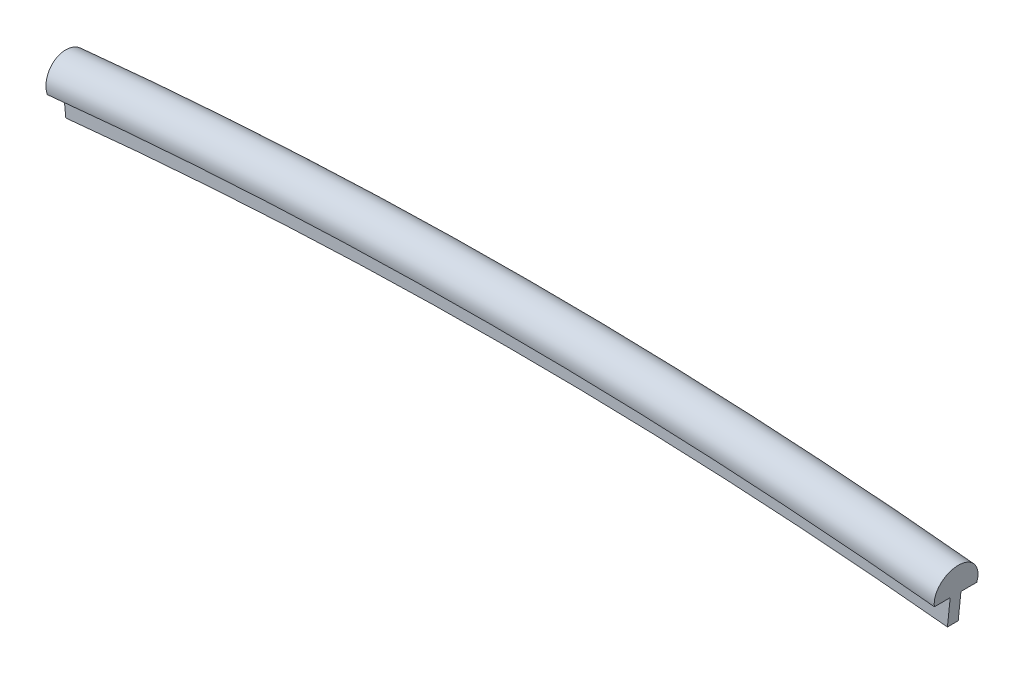
ISO-10303-21;
HEADER;
FILE_DESCRIPTION(('STEP AP214'),'2;1');
FILE_NAME('part.step','',(''),(''),'','','');
FILE_SCHEMA(('AUTOMOTIVE_DESIGN { 1 0 10303 214 1 1 1 1 }'));
ENDSEC;
DATA;
#1=APPLICATION_CONTEXT('core data for automotive mechanical design processes');
#2=APPLICATION_PROTOCOL_DEFINITION('international standard','automotive_design',2000,#1);
#3=PRODUCT_CONTEXT('',#1,'mechanical');
#4=PRODUCT('Part','Part','',(#3));
#5=PRODUCT_RELATED_PRODUCT_CATEGORY('part','',(#4));
#6=PRODUCT_DEFINITION_FORMATION('','',#4);
#7=PRODUCT_DEFINITION_CONTEXT('part definition',#1,'design');
#8=PRODUCT_DEFINITION('design','',#6,#7);
#9=PRODUCT_DEFINITION_SHAPE('','',#8);
#10=(LENGTH_UNIT() NAMED_UNIT(*) SI_UNIT(.MILLI.,.METRE.));
#11=(NAMED_UNIT(*) PLANE_ANGLE_UNIT() SI_UNIT($,.RADIAN.));
#12=(NAMED_UNIT(*) SI_UNIT($,.STERADIAN.) SOLID_ANGLE_UNIT());
#13=UNCERTAINTY_MEASURE_WITH_UNIT(LENGTH_MEASURE(1.E-05),#10,'distance_accuracy_value','');
#14=(GEOMETRIC_REPRESENTATION_CONTEXT(3) GLOBAL_UNCERTAINTY_ASSIGNED_CONTEXT((#13)) GLOBAL_UNIT_ASSIGNED_CONTEXT((#10,
#11,#12)) REPRESENTATION_CONTEXT('',''));
#15=CARTESIAN_POINT('',(0.,0.,0.));
#16=DIRECTION('',(0.,0.,1.));
#17=DIRECTION('',(1.,0.,0.));
#18=AXIS2_PLACEMENT_3D('',#15,#16,#17);
#19=CARTESIAN_POINT('',(0.,0.,70.5976415970385));
#20=DIRECTION('',(0.,0.,1.));
#21=DIRECTION('',(1.,0.,0.));
#22=AXIS2_PLACEMENT_3D('',#19,#20,#21);
#23=CYLINDRICAL_SURFACE('',#22,241.3);
#24=CARTESIAN_POINT('',(0.,0.,1.18));
#25=DIRECTION('',(0.,0.,1.));
#26=DIRECTION('',(1.,0.,0.));
#27=AXIS2_PLACEMENT_3D('',#24,#25,#26);
#28=CIRCLE('',#27,241.3);
#29=CARTESIAN_POINT('',(24.7066466184264,240.031813751578,1.18));
#30=VERTEX_POINT('',#29);
#31=CARTESIAN_POINT('',(-24.7066466184264,240.031813751578,1.18));
#32=VERTEX_POINT('',#31);
#33=EDGE_CURVE('E11',#30,#32,#28,.T.);
#34=ORIENTED_EDGE('',*,*,#33,.T.);
#35=DIRECTION('',(0.,0.,-1.));
#36=VECTOR('',#35,1.);
#37=CARTESIAN_POINT('',(-24.7066466184264,240.031813751578,1.18));
#38=LINE('',#37,#36);
#39=CARTESIAN_POINT('',(-24.7066466184264,240.031813751578,0.3));
#40=VERTEX_POINT('',#39);
#41=EDGE_CURVE('E103',#32,#40,#38,.T.);
#42=ORIENTED_EDGE('',*,*,#41,.T.);
#43=CARTESIAN_POINT('',(0.,0.,0.299999999999995));
#44=DIRECTION('',(0.,0.,1.));
#45=DIRECTION('',(1.,0.,0.));
#46=AXIS2_PLACEMENT_3D('',#43,#44,#45);
#47=CIRCLE('',#46,241.3);
#48=CARTESIAN_POINT('',(24.7066466184264,240.031813751578,0.3));
#49=VERTEX_POINT('',#48);
#50=EDGE_CURVE('E85',#49,#40,#47,.T.);
#51=ORIENTED_EDGE('',*,*,#50,.F.);
#52=DIRECTION('',(0.,0.,-1.));
#53=VECTOR('',#52,1.);
#54=CARTESIAN_POINT('',(24.7066466184264,240.031813751578,1.18));
#55=LINE('',#54,#53);
#56=EDGE_CURVE('E117',#30,#49,#55,.T.);
#57=ORIENTED_EDGE('',*,*,#56,.F.);
#58=EDGE_LOOP('',(#34,#42,#51,#57));
#59=FACE_BOUND('',#58,.T.);
#60=ADVANCED_FACE('F33',(#59),#23,.F.);
#61=CARTESIAN_POINT('',(0.,0.,0.));
#62=DIRECTION('',(0.,0.,1.));
#63=DIRECTION('',(1.,0.,0.));
#64=AXIS2_PLACEMENT_3D('',#61,#62,#63);
#65=TOROIDAL_SURFACE('',#64,241.586013989906,1.21416802890791);
#66=CARTESIAN_POINT('',(0.,0.,-1.18));
#67=DIRECTION('',(0.,0.,1.));
#68=DIRECTION('',(1.,0.,0.));
#69=AXIS2_PLACEMENT_3D('',#66,#67,#68);
#70=CIRCLE('',#69,241.3);
#71=CARTESIAN_POINT('',(24.7066466184264,240.031813751578,-1.18));
#72=VERTEX_POINT('',#71);
#73=CARTESIAN_POINT('',(-24.7066466184264,240.031813751578,-1.18));
#74=VERTEX_POINT('',#73);
#75=EDGE_CURVE('E41',#72,#74,#70,.T.);
#76=ORIENTED_EDGE('',*,*,#75,.T.);
#77=CARTESIAN_POINT('',(-24.7359315192824,240.316324554543,0.));
#78=DIRECTION('',(0.994744358688678,0.102389749765547,0.));
#79=DIRECTION('',(0.,0.,1.));
#80=AXIS2_PLACEMENT_3D('',#77,#78,#79);
#81=CIRCLE('',#80,1.21416802890791);
#82=EDGE_CURVE('E115',#74,#32,#81,.T.);
#83=ORIENTED_EDGE('',*,*,#82,.T.);
#84=ORIENTED_EDGE('',*,*,#33,.F.);
#85=CARTESIAN_POINT('',(24.7359315192824,240.316324554543,0.));
#86=DIRECTION('',(0.994744358688678,-0.102389749765547,0.));
#87=DIRECTION('',(0.,0.,1.));
#88=AXIS2_PLACEMENT_3D('',#85,#86,#87);
#89=CIRCLE('',#88,1.21416802890791);
#90=EDGE_CURVE('E97',#72,#30,#89,.T.);
#91=ORIENTED_EDGE('',*,*,#90,.F.);
#92=EDGE_LOOP('',(#76,#83,#84,#91));
#93=FACE_BOUND('',#92,.T.);
#94=ADVANCED_FACE('F35',(#93),#65,.T.);
#95=CARTESIAN_POINT('',(0.,0.,70.5976415970385));
#96=DIRECTION('',(0.,0.,1.));
#97=DIRECTION('',(1.,0.,0.));
#98=AXIS2_PLACEMENT_3D('',#95,#96,#97);
#99=CYLINDRICAL_SURFACE('',#98,241.3);
#100=CARTESIAN_POINT('',(0.,0.,-0.299999999999995));
#101=DIRECTION('',(0.,0.,1.));
#102=DIRECTION('',(1.,0.,0.));
#103=AXIS2_PLACEMENT_3D('',#100,#101,#102);
#104=CIRCLE('',#103,241.3);
#105=CARTESIAN_POINT('',(24.7066466184264,240.031813751578,-0.3));
#106=VERTEX_POINT('',#105);
#107=CARTESIAN_POINT('',(-24.7066466184264,240.031813751578,-0.3));
#108=VERTEX_POINT('',#107);
#109=EDGE_CURVE('E132',#106,#108,#104,.T.);
#110=ORIENTED_EDGE('',*,*,#109,.T.);
#111=DIRECTION('',(0.,0.,-1.));
#112=VECTOR('',#111,1.);
#113=CARTESIAN_POINT('',(-24.7066466184264,240.031813751578,-0.3));
#114=LINE('',#113,#112);
#115=EDGE_CURVE('E113',#108,#74,#114,.T.);
#116=ORIENTED_EDGE('',*,*,#115,.T.);
#117=ORIENTED_EDGE('',*,*,#75,.F.);
#118=DIRECTION('',(0.,0.,-1.));
#119=VECTOR('',#118,1.);
#120=CARTESIAN_POINT('',(24.7066466184264,240.031813751578,-0.3));
#121=LINE('',#120,#119);
#122=EDGE_CURVE('E125',#106,#72,#121,.T.);
#123=ORIENTED_EDGE('',*,*,#122,.F.);
#124=EDGE_LOOP('',(#110,#116,#117,#123));
#125=FACE_BOUND('',#124,.T.);
#126=ADVANCED_FACE('F134',(#125),#99,.F.);
#127=CARTESIAN_POINT('',(24.5530619937781,238.539697213545,-0.3));
#128=DIRECTION('',(0.,0.,1.));
#129=DIRECTION('',(1.,0.,0.));
#130=AXIS2_PLACEMENT_3D('',#127,#128,#129);
#131=PLANE('',#130);
#132=CARTESIAN_POINT('',(0.,0.,-0.299999999999995));
#133=DIRECTION('',(0.,0.,1.));
#134=DIRECTION('',(1.,0.,0.));
#135=AXIS2_PLACEMENT_3D('',#132,#133,#134);
#136=CIRCLE('',#135,239.8);
#137=CARTESIAN_POINT('',(24.5530619937781,238.539697213545,-0.3));
#138=VERTEX_POINT('',#137);
#139=CARTESIAN_POINT('',(-24.5530619937781,238.539697213545,-0.3));
#140=VERTEX_POINT('',#139);
#141=EDGE_CURVE('E129',#138,#140,#136,.T.);
#142=ORIENTED_EDGE('',*,*,#141,.T.);
#143=DIRECTION('',(-0.102389749765547,0.994744358688678,0.));
#144=VECTOR('',#143,1.);
#145=CARTESIAN_POINT('',(-24.5530619937781,238.539697213545,-0.3));
#146=LINE('',#145,#144);
#147=EDGE_CURVE('E110',#140,#108,#146,.T.);
#148=ORIENTED_EDGE('',*,*,#147,.T.);
#149=ORIENTED_EDGE('',*,*,#109,.F.);
#150=DIRECTION('',(0.102389749765547,0.994744358688678,0.));
#151=VECTOR('',#150,1.);
#152=CARTESIAN_POINT('',(24.5530619937781,238.539697213545,-0.3));
#153=LINE('',#152,#151);
#154=EDGE_CURVE('E122',#138,#106,#153,.T.);
#155=ORIENTED_EDGE('',*,*,#154,.F.);
#156=EDGE_LOOP('',(#142,#148,#149,#155));
#157=FACE_BOUND('',#156,.T.);
#158=ADVANCED_FACE('F136',(#157),#131,.F.);
#159=CARTESIAN_POINT('',(0.,0.,70.5976415970385));
#160=DIRECTION('',(0.,0.,1.));
#161=DIRECTION('',(1.,0.,0.));
#162=AXIS2_PLACEMENT_3D('',#159,#160,#161);
#163=CYLINDRICAL_SURFACE('',#162,239.8);
#164=CARTESIAN_POINT('',(0.,0.,0.299999999999995));
#165=DIRECTION('',(0.,0.,1.));
#166=DIRECTION('',(1.,0.,0.));
#167=AXIS2_PLACEMENT_3D('',#164,#165,#166);
#168=CIRCLE('',#167,239.8);
#169=CARTESIAN_POINT('',(24.5530619937781,238.539697213545,0.3));
#170=VERTEX_POINT('',#169);
#171=CARTESIAN_POINT('',(-24.5530619937781,238.539697213545,0.3));
#172=VERTEX_POINT('',#171);
#173=EDGE_CURVE('E96',#170,#172,#168,.T.);
#174=ORIENTED_EDGE('',*,*,#173,.T.);
#175=DIRECTION('',(0.,0.,-1.));
#176=VECTOR('',#175,1.);
#177=CARTESIAN_POINT('',(-24.5530619937781,238.539697213545,0.));
#178=LINE('',#177,#176);
#179=EDGE_CURVE('E105',#172,#140,#178,.T.);
#180=ORIENTED_EDGE('',*,*,#179,.T.);
#181=ORIENTED_EDGE('',*,*,#141,.F.);
#182=DIRECTION('',(0.,0.,-1.));
#183=VECTOR('',#182,1.);
#184=CARTESIAN_POINT('',(24.5530619937781,238.539697213545,0.));
#185=LINE('',#184,#183);
#186=EDGE_CURVE('E120',#170,#138,#185,.T.);
#187=ORIENTED_EDGE('',*,*,#186,.F.);
#188=EDGE_LOOP('',(#174,#180,#181,#187));
#189=FACE_BOUND('',#188,.T.);
#190=ADVANCED_FACE('F141',(#189),#163,.F.);
#191=CARTESIAN_POINT('',(24.5530619937781,238.539697213545,0.3));
#192=DIRECTION('',(0.,0.,-1.));
#193=DIRECTION('',(-1.,0.,0.));
#194=AXIS2_PLACEMENT_3D('',#191,#192,#193);
#195=PLANE('',#194);
#196=DIRECTION('',(-0.102389749765547,-0.994744358688678,0.));
#197=VECTOR('',#196,1.);
#198=CARTESIAN_POINT('',(24.5530619937781,238.539697213545,0.3));
#199=LINE('',#198,#197);
#200=EDGE_CURVE('E91',#49,#170,#199,.T.);
#201=ORIENTED_EDGE('',*,*,#200,.F.);
#202=ORIENTED_EDGE('',*,*,#50,.T.);
#203=DIRECTION('',(0.102389749765547,-0.994744358688678,0.));
#204=VECTOR('',#203,1.);
#205=CARTESIAN_POINT('',(-24.5530619937781,238.539697213545,0.3));
#206=LINE('',#205,#204);
#207=EDGE_CURVE('E88',#40,#172,#206,.T.);
#208=ORIENTED_EDGE('',*,*,#207,.T.);
#209=ORIENTED_EDGE('',*,*,#173,.F.);
#210=EDGE_LOOP('',(#201,#202,#208,#209));
#211=FACE_BOUND('',#210,.T.);
#212=ADVANCED_FACE('F87',(#211),#195,.F.);
#213=CARTESIAN_POINT('',(24.7359315192824,240.316324554543,0.));
#214=DIRECTION('',(-0.994744358688678,0.102389749765547,0.));
#215=DIRECTION('',(0.,0.,1.));
#216=AXIS2_PLACEMENT_3D('',#213,#214,#215);
#217=PLANE('',#216);
#218=ORIENTED_EDGE('',*,*,#56,.T.);
#219=ORIENTED_EDGE('',*,*,#200,.T.);
#220=ORIENTED_EDGE('',*,*,#186,.T.);
#221=ORIENTED_EDGE('',*,*,#154,.T.);
#222=ORIENTED_EDGE('',*,*,#122,.T.);
#223=ORIENTED_EDGE('',*,*,#90,.T.);
#224=EDGE_LOOP('',(#218,#219,#220,#221,#222,#223));
#225=FACE_BOUND('',#224,.T.);
#226=ADVANCED_FACE('F143',(#225),#217,.F.);
#227=CARTESIAN_POINT('',(-24.7359315192824,240.316324554543,0.));
#228=DIRECTION('',(-0.994744358688678,-0.102389749765547,0.));
#229=DIRECTION('',(0.,0.,1.));
#230=AXIS2_PLACEMENT_3D('',#227,#228,#229);
#231=PLANE('',#230);
#232=ORIENTED_EDGE('',*,*,#41,.F.);
#233=ORIENTED_EDGE('',*,*,#82,.F.);
#234=ORIENTED_EDGE('',*,*,#115,.F.);
#235=ORIENTED_EDGE('',*,*,#147,.F.);
#236=ORIENTED_EDGE('',*,*,#179,.F.);
#237=ORIENTED_EDGE('',*,*,#207,.F.);
#238=EDGE_LOOP('',(#232,#233,#234,#235,#236,#237));
#239=FACE_BOUND('',#238,.T.);
#240=ADVANCED_FACE('F101',(#239),#231,.T.);
#241=CLOSED_SHELL('',(#60,#94,#126,#158,#190,#212,#226,#240));
#242=MANIFOLD_SOLID_BREP('B2',#241);
#243=ADVANCED_BREP_SHAPE_REPRESENTATION('',(#18,#242),#14);
#244=SHAPE_DEFINITION_REPRESENTATION(#9,#243);
ENDSEC;
END-ISO-10303-21;
